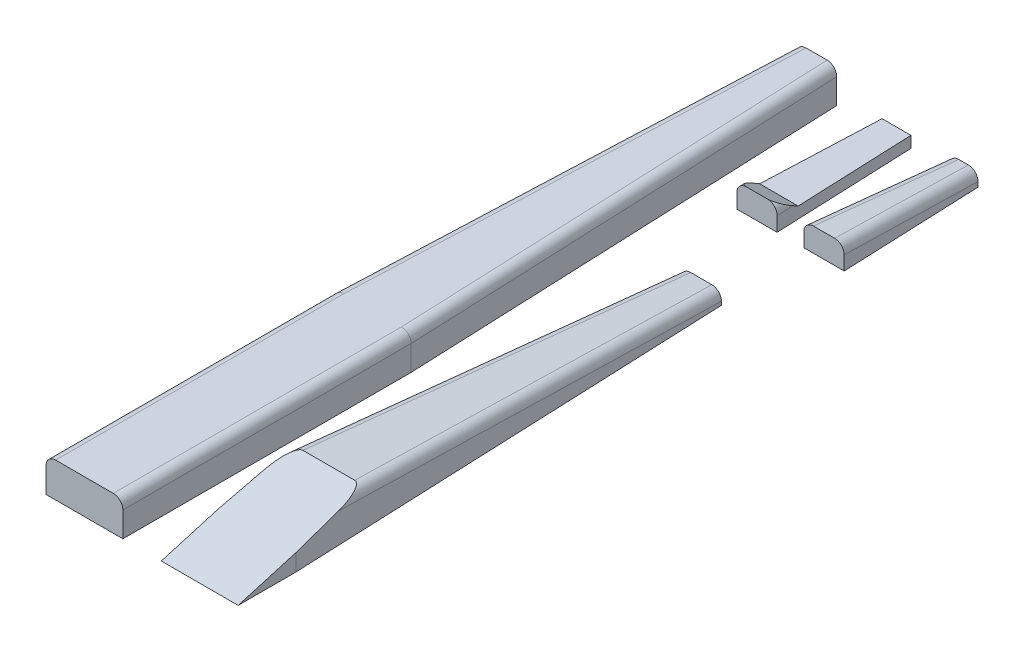
ISO-10303-21;
HEADER;
FILE_DESCRIPTION(('STEP AP214'),'2;1');
FILE_NAME('part.step','',(''),(''),'','','');
FILE_SCHEMA(('AUTOMOTIVE_DESIGN { 1 0 10303 214 1 1 1 1 }'));
ENDSEC;
DATA;
#1=APPLICATION_CONTEXT('core data for automotive mechanical design processes');
#2=APPLICATION_PROTOCOL_DEFINITION('international standard','automotive_design',2000,#1);
#3=PRODUCT_CONTEXT('',#1,'mechanical');
#4=PRODUCT('Part','Part','',(#3));
#5=PRODUCT_RELATED_PRODUCT_CATEGORY('part','',(#4));
#6=PRODUCT_DEFINITION_FORMATION('','',#4);
#7=PRODUCT_DEFINITION_CONTEXT('part definition',#1,'design');
#8=PRODUCT_DEFINITION('design','',#6,#7);
#9=PRODUCT_DEFINITION_SHAPE('','',#8);
#10=(LENGTH_UNIT() NAMED_UNIT(*) SI_UNIT(.MILLI.,.METRE.));
#11=(NAMED_UNIT(*) PLANE_ANGLE_UNIT() SI_UNIT($,.RADIAN.));
#12=(NAMED_UNIT(*) SI_UNIT($,.STERADIAN.) SOLID_ANGLE_UNIT());
#13=UNCERTAINTY_MEASURE_WITH_UNIT(LENGTH_MEASURE(1.E-05),#10,'distance_accuracy_value','');
#14=(GEOMETRIC_REPRESENTATION_CONTEXT(3) GLOBAL_UNCERTAINTY_ASSIGNED_CONTEXT((#13)) GLOBAL_UNIT_ASSIGNED_CONTEXT((#10,
#11,#12)) REPRESENTATION_CONTEXT('',''));
#15=CARTESIAN_POINT('',(0.,0.,0.));
#16=DIRECTION('',(0.,0.,1.));
#17=DIRECTION('',(1.,0.,0.));
#18=AXIS2_PLACEMENT_3D('',#15,#16,#17);
#19=CARTESIAN_POINT('',(73.3291840749564,0.,304.8));
#20=DIRECTION('',(0.,-1.,0.));
#21=DIRECTION('',(0.,0.,1.));
#22=AXIS2_PLACEMENT_3D('',#19,#20,#21);
#23=PLANE('',#22);
#24=DIRECTION('',(1.,0.,0.));
#25=VECTOR('',#24,1.);
#26=CARTESIAN_POINT('',(73.3291840749564,0.,-662.961500261916));
#27=LINE('',#26,#25);
#28=CARTESIAN_POINT('',(46.6834948564911,0.,-662.961500261916));
#29=VERTEX_POINT('',#28);
#30=CARTESIAN_POINT('',(99.9748732934217,0.,-662.961500261916));
#31=VERTEX_POINT('',#30);
#32=EDGE_CURVE('P0_E106',#29,#31,#27,.T.);
#33=ORIENTED_EDGE('',*,*,#32,.T.);
#34=DIRECTION('',(0.0411377422918956,0.,0.999153484785559));
#35=VECTOR('',#34,1.);
#36=CARTESIAN_POINT('',(139.707602562453,0.,302.067028224329));
#37=LINE('',#36,#35);
#38=CARTESIAN_POINT('',(124.129184074956,0.,-76.3015999999999));
#39=VERTEX_POINT('',#38);
#40=EDGE_CURVE('P0_E96',#31,#39,#37,.T.);
#41=ORIENTED_EDGE('',*,*,#40,.T.);
#42=DIRECTION('',(0.,0.,-1.));
#43=VECTOR('',#42,1.);
#44=CARTESIAN_POINT('',(124.129184074956,0.,-76.3015999999999));
#45=LINE('',#44,#43);
#46=CARTESIAN_POINT('',(124.129184074956,0.,1.11022302462516E-13));
#47=VERTEX_POINT('',#46);
#48=EDGE_CURVE('P0_E83',#47,#39,#45,.T.);
#49=ORIENTED_EDGE('',*,*,#48,.F.);
#50=DIRECTION('',(-1.,0.,0.));
#51=VECTOR('',#50,1.);
#52=CARTESIAN_POINT('',(124.139207207653,0.,0.));
#53=LINE('',#52,#51);
#54=CARTESIAN_POINT('',(22.5291840749564,0.,1.11022302462516E-13));
#55=VERTEX_POINT('',#54);
#56=EDGE_CURVE('P0_E94',#47,#55,#53,.T.);
#57=ORIENTED_EDGE('',*,*,#56,.T.);
#58=DIRECTION('',(0.,0.,1.));
#59=VECTOR('',#58,1.);
#60=CARTESIAN_POINT('',(22.5291840749564,0.,-76.3015999999999));
#61=LINE('',#60,#59);
#62=CARTESIAN_POINT('',(22.5291840749564,0.,-76.3015999999999));
#63=VERTEX_POINT('',#62);
#64=EDGE_CURVE('P0_E98',#63,#55,#61,.T.);
#65=ORIENTED_EDGE('',*,*,#64,.F.);
#66=DIRECTION('',(0.0411377422918955,0.,-0.999153484785559));
#67=VECTOR('',#66,1.);
#68=CARTESIAN_POINT('',(6.95076558745931,0.,302.067028224329));
#69=LINE('',#68,#67);
#70=EDGE_CURVE('P0_E102',#63,#29,#69,.T.);
#71=ORIENTED_EDGE('',*,*,#70,.T.);
#72=EDGE_LOOP('',(#33,#41,#49,#57,#65,#71));
#73=FACE_BOUND('',#72,.T.);
#74=ADVANCED_FACE('P0_F17',(#73),#23,.T.);
#75=CARTESIAN_POINT('',(73.3291840749564,5.08000000000002,-662.961500261916));
#76=DIRECTION('',(0.,0.,1.));
#77=DIRECTION('',(-1.,0.,0.));
#78=AXIS2_PLACEMENT_3D('',#75,#76,#77);
#79=PLANE('',#78);
#80=ORIENTED_EDGE('',*,*,#32,.F.);
#81=DIRECTION('',(0.,-1.,0.));
#82=VECTOR('',#81,1.);
#83=CARTESIAN_POINT('',(46.6834948564911,5.08,-662.961500261916));
#84=LINE('',#83,#82);
#85=CARTESIAN_POINT('',(46.6834948564911,4.5399926448005,-662.961500261916));
#86=VERTEX_POINT('',#85);
#87=EDGE_CURVE('P0_E117',#86,#29,#84,.T.);
#88=ORIENTED_EDGE('',*,*,#87,.F.);
#89=CARTESIAN_POINT('',(59.3942547080926,4.50557569308067,-662.961500261916));
#90=DIRECTION('',(0.,0.,1.));
#91=DIRECTION('',(-0.52999894000318,0.847998304005088,0.));
#92=AXIS2_PLACEMENT_3D('',#89,#90,#91);
#93=ELLIPSE('',#92,12.738263656327,12.7);
#94=CARTESIAN_POINT('',(59.3598830971587,17.2331027495444,-662.961500261916));
#95=VERTEX_POINT('',#94);
#96=EDGE_CURVE('P0_E107',#86,#95,#93,.F.);
#97=ORIENTED_EDGE('',*,*,#96,.T.);
#98=DIRECTION('',(-1.,0.,0.));
#99=VECTOR('',#98,1.);
#100=CARTESIAN_POINT('',(73.3291840749564,17.2331027495444,-662.961500261916));
#101=LINE('',#100,#99);
#102=CARTESIAN_POINT('',(87.298485052754,17.2331027495444,-662.961500261916));
#103=VERTEX_POINT('',#102);
#104=EDGE_CURVE('P0_E116',#103,#95,#101,.T.);
#105=ORIENTED_EDGE('',*,*,#104,.F.);
#106=CARTESIAN_POINT('',(87.2641134418202,4.50557569308069,-662.961500261916));
#107=DIRECTION('',(0.,0.,1.));
#108=DIRECTION('',(0.52999894000318,0.847998304005088,0.));
#109=AXIS2_PLACEMENT_3D('',#106,#107,#108);
#110=ELLIPSE('',#109,12.738263656327,12.7);
#111=CARTESIAN_POINT('',(99.9748732934217,4.53999264480055,-662.961500261916));
#112=VERTEX_POINT('',#111);
#113=EDGE_CURVE('P0_E97',#103,#112,#110,.F.);
#114=ORIENTED_EDGE('',*,*,#113,.T.);
#115=DIRECTION('',(0.,1.,0.));
#116=VECTOR('',#115,1.);
#117=CARTESIAN_POINT('',(99.9748732934216,5.08000000000003,-662.961500261916));
#118=LINE('',#117,#116);
#119=EDGE_CURVE('P0_E113',#31,#112,#118,.T.);
#120=ORIENTED_EDGE('',*,*,#119,.F.);
#121=EDGE_LOOP('',(#80,#88,#97,#105,#114,#120));
#122=FACE_BOUND('',#121,.T.);
#123=ADVANCED_FACE('P0_F168',(#122),#79,.F.);
#124=CARTESIAN_POINT('',(22.5291840749564,55.88,-76.3015999999999));
#125=DIRECTION('',(-1.,0.,0.));
#126=DIRECTION('',(0.,0.,-1.));
#127=AXIS2_PLACEMENT_3D('',#124,#125,#126);
#128=PLANE('',#127);
#129=DIRECTION('',(0.,-1.,0.));
#130=VECTOR('',#129,1.);
#131=CARTESIAN_POINT('',(22.5291840749564,55.88,-76.3015999999999));
#132=LINE('',#131,#130);
#133=CARTESIAN_POINT('',(22.5291840749564,22.2124679358292,-76.3015999999999));
#134=VERTEX_POINT('',#133);
#135=EDGE_CURVE('P0_E26',#134,#63,#132,.T.);
#136=ORIENTED_EDGE('',*,*,#135,.T.);
#137=ORIENTED_EDGE('',*,*,#64,.T.);
#138=DIRECTION('',(0.,-0.279510972848873,0.960142497787217));
#139=VECTOR('',#138,1.);
#140=CARTESIAN_POINT('',(22.5291840749564,24.8427904722853,-85.3369678225879));
#141=LINE('',#140,#139);
#142=EDGE_CURVE('P0_E40',#134,#55,#141,.T.);
#143=ORIENTED_EDGE('',*,*,#142,.F.);
#144=EDGE_LOOP('',(#136,#137,#143));
#145=FACE_BOUND('',#144,.T.);
#146=ADVANCED_FACE('P0_F176',(#145),#128,.T.);
#147=CARTESIAN_POINT('',(124.129184074956,55.88,-76.3015999999999));
#148=DIRECTION('',(1.,0.,0.));
#149=DIRECTION('',(0.,0.,1.));
#150=AXIS2_PLACEMENT_3D('',#147,#148,#149);
#151=PLANE('',#150);
#152=DIRECTION('',(0.,0.279510972848873,-0.960142497787217));
#153=VECTOR('',#152,1.);
#154=CARTESIAN_POINT('',(124.129184074956,24.8427904722854,-85.3369678225879));
#155=LINE('',#154,#153);
#156=CARTESIAN_POINT('',(124.129184074956,22.2124679358292,-76.3016));
#157=VERTEX_POINT('',#156);
#158=EDGE_CURVE('P0_E80',#47,#157,#155,.T.);
#159=ORIENTED_EDGE('',*,*,#158,.F.);
#160=ORIENTED_EDGE('',*,*,#48,.T.);
#161=DIRECTION('',(0.,-1.,0.));
#162=VECTOR('',#161,1.);
#163=CARTESIAN_POINT('',(124.129184074956,55.88,-76.3015999999999));
#164=LINE('',#163,#162);
#165=EDGE_CURVE('P0_E11',#39,#157,#164,.F.);
#166=ORIENTED_EDGE('',*,*,#165,.T.);
#167=EDGE_LOOP('',(#159,#160,#166));
#168=FACE_BOUND('',#167,.T.);
#169=ADVANCED_FACE('P0_F82',(#168),#151,.T.);
#170=CARTESIAN_POINT('',(6.95076558745931,5.07999999999999,302.067028224329));
#171=DIRECTION('',(0.999153484785559,0.,0.0411377422918955));
#172=DIRECTION('',(-0.0411377422918955,0.,0.999153484785559));
#173=AXIS2_PLACEMENT_3D('',#170,#171,#172);
#174=PLANE('',#173);
#175=ORIENTED_EDGE('',*,*,#70,.F.);
#176=ORIENTED_EDGE('',*,*,#135,.F.);
#177=DIRECTION('',(0.0395007060040846,0.279292826429343,-0.959393147427209));
#178=VECTOR('',#177,1.);
#179=CARTESIAN_POINT('',(7.97694215964105,-80.6802949173641,277.14325163918));
#180=LINE('',#179,#178);
#181=CARTESIAN_POINT('',(24.9482179318287,39.3164357242603,-135.055094315715));
#182=VERTEX_POINT('',#181);
#183=EDGE_CURVE('P0_E88',#134,#182,#180,.T.);
#184=ORIENTED_EDGE('',*,*,#183,.T.);
#185=DIRECTION('',(-0.041048919791328,0.0656782716661249,0.996996163891775));
#186=VECTOR('',#185,1.);
#187=CARTESIAN_POINT('',(7.12070222197621,67.8404608600243,297.939607245182));
#188=LINE('',#187,#186);
#189=EDGE_CURVE('P0_E136',#182,#86,#188,.F.);
#190=ORIENTED_EDGE('',*,*,#189,.T.);
#191=ORIENTED_EDGE('',*,*,#87,.T.);
#192=EDGE_LOOP('',(#175,#176,#184,#190,#191));
#193=FACE_BOUND('',#192,.T.);
#194=ADVANCED_FACE('P0_F19',(#193),#174,.F.);
#195=CARTESIAN_POINT('',(139.707602562453,5.08000000000004,302.067028224329));
#196=DIRECTION('',(-0.999153484785559,0.,0.0411377422918956));
#197=DIRECTION('',(-0.0411377422918956,0.,-0.999153484785559));
#198=AXIS2_PLACEMENT_3D('',#195,#196,#197);
#199=PLANE('',#198);
#200=ORIENTED_EDGE('',*,*,#40,.F.);
#201=ORIENTED_EDGE('',*,*,#119,.T.);
#202=DIRECTION('',(0.041048919791328,0.0656782716661249,0.996996163891775));
#203=VECTOR('',#202,1.);
#204=CARTESIAN_POINT('',(139.537665927937,67.8404608600244,297.939607245182));
#205=LINE('',#204,#203);
#206=CARTESIAN_POINT('',(121.710150218084,39.3164357242604,-135.055094315715));
#207=VERTEX_POINT('',#206);
#208=EDGE_CURVE('P0_E139',#112,#207,#205,.T.);
#209=ORIENTED_EDGE('',*,*,#208,.T.);
#210=DIRECTION('',(0.0395007060040849,-0.279292826429344,0.95939314742721));
#211=VECTOR('',#210,1.);
#212=CARTESIAN_POINT('',(138.681425990272,-80.6802949173641,277.14325163918));
#213=LINE('',#212,#211);
#214=EDGE_CURVE('P0_E150',#207,#157,#213,.T.);
#215=ORIENTED_EDGE('',*,*,#214,.T.);
#216=ORIENTED_EDGE('',*,*,#165,.F.);
#217=EDGE_LOOP('',(#200,#201,#209,#215,#216));
#218=FACE_BOUND('',#217,.T.);
#219=ADVANCED_FACE('P0_F177',(#218),#199,.F.);
#220=CARTESIAN_POINT('',(124.139207207653,0.,0.));
#221=DIRECTION('',(0.,-0.960142497787217,-0.279510972848873));
#222=DIRECTION('',(0.,-0.279510972848873,0.960142497787217));
#223=AXIS2_PLACEMENT_3D('',#220,#221,#222);
#224=PLANE('',#223);
#225=ORIENTED_EDGE('',*,*,#158,.T.);
#226=ORIENTED_EDGE('',*,*,#214,.F.);
#227=CARTESIAN_POINT('',(109.003359761759,39.2883698049835,-134.958685643231));
#228=DIRECTION('',(0.,-0.960142497787217,-0.279510972848873));
#229=DIRECTION('',(0.043678473320131,-0.279244218779965,0.959226176272515));
#230=AXIS2_PLACEMENT_3D('',#227,#228,#229);
#231=ELLIPSE('',#230,37.1636397060836,12.7);
#232=CARTESIAN_POINT('',(107.569833047609,49.6672595413131,-170.611000162867));
#233=VERTEX_POINT('',#232);
#234=EDGE_CURVE('P0_E135',#207,#233,#231,.F.);
#235=ORIENTED_EDGE('',*,*,#234,.T.);
#236=DIRECTION('',(1.,0.,0.));
#237=VECTOR('',#236,1.);
#238=CARTESIAN_POINT('',(73.3291840749562,49.6672595413131,-170.611000162867));
#239=LINE('',#238,#237);
#240=CARTESIAN_POINT('',(39.0885351023033,49.6672595413131,-170.611000162867));
#241=VERTEX_POINT('',#240);
#242=EDGE_CURVE('P0_E131',#241,#233,#239,.T.);
#243=ORIENTED_EDGE('',*,*,#242,.F.);
#244=CARTESIAN_POINT('',(37.6550083881533,39.2883698049835,-134.958685643231));
#245=DIRECTION('',(0.,-0.960142497787217,-0.279510972848873));
#246=DIRECTION('',(-0.0436784733201308,-0.279244218779965,0.959226176272515));
#247=AXIS2_PLACEMENT_3D('',#244,#245,#246);
#248=ELLIPSE('',#247,37.1636397060836,12.7);
#249=EDGE_CURVE('P0_E115',#241,#182,#248,.F.);
#250=ORIENTED_EDGE('',*,*,#249,.T.);
#251=ORIENTED_EDGE('',*,*,#183,.F.);
#252=ORIENTED_EDGE('',*,*,#142,.T.);
#253=ORIENTED_EDGE('',*,*,#56,.F.);
#254=EDGE_LOOP('',(#225,#226,#235,#243,#250,#251,#252,#253));
#255=FACE_BOUND('',#254,.T.);
#256=ADVANCED_FACE('P0_F100',(#255),#224,.F.);
#257=CARTESIAN_POINT('',(73.3291840749563,80.6575259125343,299.821243352271));
#258=DIRECTION('',(0.,-0.997837203068467,0.0657336760914669));
#259=DIRECTION('',(0.,0.0657336760914669,0.997837203068468));
#260=AXIS2_PLACEMENT_3D('',#257,#258,#259);
#261=PLANE('',#260);
#262=DIRECTION('',(0.041048919791328,0.0656782716661249,0.996996163891775));
#263=VECTOR('',#262,1.);
#264=CARTESIAN_POINT('',(126.84841667116,80.5129933389939,297.627238885928));
#265=LINE('',#264,#263);
#266=EDGE_CURVE('P0_E112',#233,#103,#265,.F.);
#267=ORIENTED_EDGE('',*,*,#266,.T.);
#268=ORIENTED_EDGE('',*,*,#104,.T.);
#269=DIRECTION('',(-0.041048919791328,0.0656782716661249,0.996996163891775));
#270=VECTOR('',#269,1.);
#271=CARTESIAN_POINT('',(19.8099514787528,80.5129933389939,297.627238885928));
#272=LINE('',#271,#270);
#273=EDGE_CURVE('P0_E130',#95,#241,#272,.T.);
#274=ORIENTED_EDGE('',*,*,#273,.T.);
#275=ORIENTED_EDGE('',*,*,#242,.T.);
#276=EDGE_LOOP('',(#267,#268,#274,#275));
#277=FACE_BOUND('',#276,.T.);
#278=ADVANCED_FACE('P0_F155',(#277),#261,.F.);
#279=CARTESIAN_POINT('',(19.8099514787528,67.8404608600243,298.462056572289));
#280=DIRECTION('',(-0.041048919791328,0.0656782716661249,0.996996163891775));
#281=DIRECTION('',(0.,0.997837203068468,-0.0657336760914669));
#282=AXIS2_PLACEMENT_3D('',#279,#280,#281);
#283=CYLINDRICAL_SURFACE('',#282,12.7);
#284=ORIENTED_EDGE('',*,*,#96,.F.);
#285=ORIENTED_EDGE('',*,*,#189,.F.);
#286=ORIENTED_EDGE('',*,*,#249,.F.);
#287=ORIENTED_EDGE('',*,*,#273,.F.);
#288=EDGE_LOOP('',(#284,#285,#286,#287));
#289=FACE_BOUND('',#288,.T.);
#290=ADVANCED_FACE('P0_F172',(#289),#283,.T.);
#291=CARTESIAN_POINT('',(126.84841667116,67.8404608600244,298.462056572289));
#292=DIRECTION('',(0.041048919791328,0.0656782716661249,0.996996163891775));
#293=DIRECTION('',(0.,0.997837203068467,-0.0657336760914669));
#294=AXIS2_PLACEMENT_3D('',#291,#292,#293);
#295=CYLINDRICAL_SURFACE('',#294,12.7);
#296=ORIENTED_EDGE('',*,*,#113,.F.);
#297=ORIENTED_EDGE('',*,*,#266,.F.);
#298=ORIENTED_EDGE('',*,*,#234,.F.);
#299=ORIENTED_EDGE('',*,*,#208,.F.);
#300=EDGE_LOOP('',(#296,#297,#298,#299));
#301=FACE_BOUND('',#300,.T.);
#302=ADVANCED_FACE('P0_F162',(#301),#295,.T.);
#303=CLOSED_SHELL('',(#74,#123,#146,#169,#194,#219,#256,#278,#290,#302));
#304=MANIFOLD_SOLID_BREP('P0_B1',#303);
#305=CARTESIAN_POINT('',(-129.88083905774,0.,0.));
#306=DIRECTION('',(0.,1.,0.));
#307=DIRECTION('',(0.,0.,1.));
#308=AXIS2_PLACEMENT_3D('',#305,#306,#307);
#309=PLANE('',#308);
#310=DIRECTION('',(0.,0.,-1.));
#311=VECTOR('',#310,1.);
#312=CARTESIAN_POINT('',(-129.870815925044,0.,-381.1016));
#313=LINE('',#312,#311);
#314=CARTESIAN_POINT('',(-129.870815925044,0.,0.));
#315=VERTEX_POINT('',#314);
#316=CARTESIAN_POINT('',(-129.870815925044,0.,-381.1016));
#317=VERTEX_POINT('',#316);
#318=EDGE_CURVE('P1_E108',#315,#317,#313,.T.);
#319=ORIENTED_EDGE('',*,*,#318,.T.);
#320=DIRECTION('',(-0.0411377422918956,0.,0.999153484785559));
#321=VECTOR('',#320,1.);
#322=CARTESIAN_POINT('',(-145.449234412541,0.,-2.732971775671));
#323=LINE('',#322,#321);
#324=CARTESIAN_POINT('',(-105.716505143509,0.,-967.761500261916));
#325=VERTEX_POINT('',#324);
#326=EDGE_CURVE('P1_E21',#325,#317,#323,.T.);
#327=ORIENTED_EDGE('',*,*,#326,.F.);
#328=DIRECTION('',(-1.,0.,0.));
#329=VECTOR('',#328,1.);
#330=CARTESIAN_POINT('',(-79.0708159250436,0.,-967.761500261916));
#331=LINE('',#330,#329);
#332=CARTESIAN_POINT('',(-52.4251267065783,0.,-967.761500261916));
#333=VERTEX_POINT('',#332);
#334=EDGE_CURVE('P1_E11',#333,#325,#331,.T.);
#335=ORIENTED_EDGE('',*,*,#334,.F.);
#336=DIRECTION('',(-0.0411377422918955,0.,-0.999153484785559));
#337=VECTOR('',#336,1.);
#338=CARTESIAN_POINT('',(-12.6923974375465,0.,-2.73297177567099));
#339=LINE('',#338,#337);
#340=CARTESIAN_POINT('',(-28.2708159250436,0.,-381.1016));
#341=VERTEX_POINT('',#340);
#342=EDGE_CURVE('P1_E26',#341,#333,#339,.T.);
#343=ORIENTED_EDGE('',*,*,#342,.F.);
#344=DIRECTION('',(0.,0.,1.));
#345=VECTOR('',#344,1.);
#346=CARTESIAN_POINT('',(-28.2708159250436,0.,-381.1016));
#347=LINE('',#346,#345);
#348=CARTESIAN_POINT('',(-28.2708159250436,0.,0.));
#349=VERTEX_POINT('',#348);
#350=EDGE_CURVE('P1_E33',#341,#349,#347,.T.);
#351=ORIENTED_EDGE('',*,*,#350,.T.);
#352=DIRECTION('',(1.,0.,0.));
#353=VECTOR('',#352,1.);
#354=CARTESIAN_POINT('',(-129.88083905774,0.,0.));
#355=LINE('',#354,#353);
#356=EDGE_CURVE('P1_E145',#315,#349,#355,.T.);
#357=ORIENTED_EDGE('',*,*,#356,.F.);
#358=EDGE_LOOP('',(#319,#327,#335,#343,#351,#357));
#359=FACE_BOUND('',#358,.T.);
#360=ADVANCED_FACE('P1_F17',(#359),#309,.F.);
#361=CARTESIAN_POINT('',(-25.3816466943231,33.02,-2.21052244856392));
#362=DIRECTION('',(-0.0411377422918955,0.,-0.999153484785559));
#363=DIRECTION('',(-0.999153484785559,0.,0.0411377422918955));
#364=AXIS2_PLACEMENT_3D('',#361,#362,#363);
#365=CYLINDRICAL_SURFACE('',#364,12.7);
#366=CARTESIAN_POINT('',(-65.1358865581798,33.0199999999999,-967.761500261916));
#367=DIRECTION('',(0.,0.,1.));
#368=DIRECTION('',(-1.,0.,0.));
#369=AXIS2_PLACEMENT_3D('',#366,#367,#368);
#370=ELLIPSE('',#369,12.7107598516015,12.7);
#371=CARTESIAN_POINT('',(-65.1358865581798,45.7199999999999,-967.761500261916));
#372=VERTEX_POINT('',#371);
#373=CARTESIAN_POINT('',(-52.4251267065783,33.02,-967.761500261916));
#374=VERTEX_POINT('',#373);
#375=EDGE_CURVE('P1_E170',#372,#374,#370,.F.);
#376=ORIENTED_EDGE('',*,*,#375,.F.);
#377=DIRECTION('',(0.0411377422918955,0.,0.999153484785559));
#378=VECTOR('',#377,1.);
#379=CARTESIAN_POINT('',(-72.7100651818201,45.7199999999999,-1151.72315067289));
#380=LINE('',#379,#378);
#381=CARTESIAN_POINT('',(-40.9708159250436,45.72,-380.840264724303));
#382=VERTEX_POINT('',#381);
#383=EDGE_CURVE('P1_E124',#382,#372,#380,.F.);
#384=ORIENTED_EDGE('',*,*,#383,.F.);
#385=CARTESIAN_POINT('',(-40.9708159250437,33.02,-380.840264724309));
#386=DIRECTION('',(-0.0205732254938469,0.,-0.999788348798274));
#387=DIRECTION('',(-0.999788348798274,0.,0.0205732254938442));
#388=AXIS2_PLACEMENT_3D('',#385,#386,#387);
#389=ELLIPSE('',#388,12.7026885392945,12.7);
#390=CARTESIAN_POINT('',(-28.2708159250436,33.02,-381.1016));
#391=VERTEX_POINT('',#390);
#392=EDGE_CURVE('P1_E141',#391,#382,#389,.F.);
#393=ORIENTED_EDGE('',*,*,#392,.F.);
#394=DIRECTION('',(0.0411377422918955,0.,0.999153484785559));
#395=VECTOR('',#394,1.);
#396=CARTESIAN_POINT('',(-28.2708159250434,33.02,-381.101599999996));
#397=LINE('',#396,#395);
#398=EDGE_CURVE('P1_E150',#374,#391,#397,.T.);
#399=ORIENTED_EDGE('',*,*,#398,.F.);
#400=EDGE_LOOP('',(#376,#384,#393,#399));
#401=FACE_BOUND('',#400,.T.);
#402=ADVANCED_FACE('P1_F168',(#401),#365,.T.);
#403=CARTESIAN_POINT('',(-117.009627582034,33.0199999999999,-384.755207199316));
#404=DIRECTION('',(0.0411377422918956,0.,-0.999153484785559));
#405=DIRECTION('',(-0.999153484785559,0.,-0.0411377422918956));
#406=AXIS2_PLACEMENT_3D('',#403,#404,#405);
#407=CYLINDRICAL_SURFACE('',#406,12.7);
#408=CARTESIAN_POINT('',(-93.0057452919073,33.0199999999999,-967.761500261916));
#409=DIRECTION('',(0.,0.,1.));
#410=DIRECTION('',(1.,0.,0.));
#411=AXIS2_PLACEMENT_3D('',#408,#409,#410);
#412=ELLIPSE('',#411,12.7107598516015,12.7);
#413=CARTESIAN_POINT('',(-105.716505143509,33.0199999999999,-967.761500261916));
#414=VERTEX_POINT('',#413);
#415=CARTESIAN_POINT('',(-93.0057452919073,45.7199999999999,-967.761500261916));
#416=VERTEX_POINT('',#415);
#417=EDGE_CURVE('P1_E179',#414,#416,#412,.F.);
#418=ORIENTED_EDGE('',*,*,#417,.F.);
#419=DIRECTION('',(-0.0411377422918956,0.,0.999153484785559));
#420=VECTOR('',#419,1.);
#421=CARTESIAN_POINT('',(-98.1208159250436,33.0199999999999,-1152.2456));
#422=LINE('',#421,#420);
#423=CARTESIAN_POINT('',(-129.870815925044,33.0199999999999,-381.1016));
#424=VERTEX_POINT('',#423);
#425=EDGE_CURVE('P1_E99',#424,#414,#422,.F.);
#426=ORIENTED_EDGE('',*,*,#425,.F.);
#427=CARTESIAN_POINT('',(-117.170815925044,33.0199999999999,-380.840264724303));
#428=DIRECTION('',(0.0205732254938469,0.,-0.999788348798274));
#429=DIRECTION('',(0.999788348798274,0.,0.0205732254938469));
#430=AXIS2_PLACEMENT_3D('',#427,#428,#429);
#431=ELLIPSE('',#430,12.7026885392945,12.7);
#432=CARTESIAN_POINT('',(-117.170815925044,45.7199999999999,-380.840264724303));
#433=VERTEX_POINT('',#432);
#434=EDGE_CURVE('P1_E110',#433,#424,#431,.F.);
#435=ORIENTED_EDGE('',*,*,#434,.F.);
#436=DIRECTION('',(-0.0411377422918956,0.,0.999153484785559));
#437=VECTOR('',#436,1.);
#438=CARTESIAN_POINT('',(-117.181566668267,45.7199999999999,-380.57915067289));
#439=LINE('',#438,#437);
#440=EDGE_CURVE('P1_E133',#416,#433,#439,.T.);
#441=ORIENTED_EDGE('',*,*,#440,.F.);
#442=EDGE_LOOP('',(#418,#426,#435,#441));
#443=FACE_BOUND('',#442,.T.);
#444=ADVANCED_FACE('P1_F207',(#443),#407,.T.);
#445=CARTESIAN_POINT('',(-117.170815925044,33.0199999999999,-381.1016));
#446=DIRECTION('',(0.,0.,1.));
#447=DIRECTION('',(1.,0.,0.));
#448=AXIS2_PLACEMENT_3D('',#445,#446,#447);
#449=CYLINDRICAL_SURFACE('',#448,12.7);
#450=ORIENTED_EDGE('',*,*,#434,.T.);
#451=DIRECTION('',(0.,0.,1.));
#452=VECTOR('',#451,1.);
#453=CARTESIAN_POINT('',(-129.870815925044,33.0199999999999,-381.1016));
#454=LINE('',#453,#452);
#455=CARTESIAN_POINT('',(-129.870815925044,33.0199999999999,0.));
#456=VERTEX_POINT('',#455);
#457=EDGE_CURVE('P1_E106',#456,#424,#454,.F.);
#458=ORIENTED_EDGE('',*,*,#457,.F.);
#459=CARTESIAN_POINT('',(-117.170815925044,33.0199999999999,0.));
#460=DIRECTION('',(0.,0.,1.));
#461=DIRECTION('',(1.,0.,0.));
#462=AXIS2_PLACEMENT_3D('',#459,#460,#461);
#463=CIRCLE('',#462,12.7);
#464=CARTESIAN_POINT('',(-117.170815925044,45.7199999999999,0.));
#465=VERTEX_POINT('',#464);
#466=EDGE_CURVE('P1_E89',#465,#456,#463,.T.);
#467=ORIENTED_EDGE('',*,*,#466,.F.);
#468=DIRECTION('',(0.,0.,1.));
#469=VECTOR('',#468,1.);
#470=CARTESIAN_POINT('',(-117.170815925044,45.7199999999999,-381.1016));
#471=LINE('',#470,#469);
#472=EDGE_CURVE('P1_E136',#433,#465,#471,.T.);
#473=ORIENTED_EDGE('',*,*,#472,.F.);
#474=EDGE_LOOP('',(#450,#458,#467,#473));
#475=FACE_BOUND('',#474,.T.);
#476=ADVANCED_FACE('P1_F113',(#475),#449,.T.);
#477=CARTESIAN_POINT('',(-28.2708159250436,45.72,-381.1016));
#478=DIRECTION('',(0.,1.,0.));
#479=DIRECTION('',(-1.,0.,0.));
#480=AXIS2_PLACEMENT_3D('',#477,#478,#479);
#481=PLANE('',#480);
#482=DIRECTION('',(1.,0.,0.));
#483=VECTOR('',#482,1.);
#484=CARTESIAN_POINT('',(-256.921615925044,45.7199999999999,-967.761500261916));
#485=LINE('',#484,#483);
#486=EDGE_CURVE('P1_E174',#416,#372,#485,.T.);
#487=ORIENTED_EDGE('',*,*,#486,.F.);
#488=ORIENTED_EDGE('',*,*,#440,.T.);
#489=ORIENTED_EDGE('',*,*,#472,.T.);
#490=DIRECTION('',(-1.,0.,0.));
#491=VECTOR('',#490,1.);
#492=CARTESIAN_POINT('',(-28.2708159250436,45.72,0.));
#493=LINE('',#492,#491);
#494=CARTESIAN_POINT('',(-40.9708159250436,45.72,0.));
#495=VERTEX_POINT('',#494);
#496=EDGE_CURVE('P1_E94',#495,#465,#493,.T.);
#497=ORIENTED_EDGE('',*,*,#496,.F.);
#498=DIRECTION('',(0.,0.,1.));
#499=VECTOR('',#498,1.);
#500=CARTESIAN_POINT('',(-40.9708159250436,45.72,-381.1016));
#501=LINE('',#500,#499);
#502=EDGE_CURVE('P1_E129',#495,#382,#501,.F.);
#503=ORIENTED_EDGE('',*,*,#502,.T.);
#504=ORIENTED_EDGE('',*,*,#383,.T.);
#505=EDGE_LOOP('',(#487,#488,#489,#497,#503,#504));
#506=FACE_BOUND('',#505,.T.);
#507=ADVANCED_FACE('P1_F173',(#506),#481,.T.);
#508=CARTESIAN_POINT('',(-40.9708159250436,33.02,-381.1016));
#509=DIRECTION('',(0.,0.,1.));
#510=DIRECTION('',(1.,0.,0.));
#511=AXIS2_PLACEMENT_3D('',#508,#509,#510);
#512=CYLINDRICAL_SURFACE('',#511,12.7);
#513=ORIENTED_EDGE('',*,*,#392,.T.);
#514=ORIENTED_EDGE('',*,*,#502,.F.);
#515=CARTESIAN_POINT('',(-40.9708159250436,33.02,0.));
#516=DIRECTION('',(0.,0.,1.));
#517=DIRECTION('',(1.,0.,0.));
#518=AXIS2_PLACEMENT_3D('',#515,#516,#517);
#519=CIRCLE('',#518,12.7);
#520=CARTESIAN_POINT('',(-28.2708159250436,33.02,0.));
#521=VERTEX_POINT('',#520);
#522=EDGE_CURVE('P1_E100',#521,#495,#519,.T.);
#523=ORIENTED_EDGE('',*,*,#522,.F.);
#524=DIRECTION('',(0.,0.,1.));
#525=VECTOR('',#524,1.);
#526=CARTESIAN_POINT('',(-28.2708159250436,33.02,-381.1016));
#527=LINE('',#526,#525);
#528=EDGE_CURVE('P1_E154',#391,#521,#527,.T.);
#529=ORIENTED_EDGE('',*,*,#528,.F.);
#530=EDGE_LOOP('',(#513,#514,#523,#529));
#531=FACE_BOUND('',#530,.T.);
#532=ADVANCED_FACE('P1_F162',(#531),#512,.T.);
#533=CARTESIAN_POINT('',(-28.2708159250436,-55.88,-381.1016));
#534=DIRECTION('',(1.,0.,0.));
#535=DIRECTION('',(0.,0.,-1.));
#536=AXIS2_PLACEMENT_3D('',#533,#534,#535);
#537=PLANE('',#536);
#538=ORIENTED_EDGE('',*,*,#350,.F.);
#539=DIRECTION('',(0.,1.,0.));
#540=VECTOR('',#539,1.);
#541=CARTESIAN_POINT('',(-28.2708159250436,-55.88,-381.1016));
#542=LINE('',#541,#540);
#543=EDGE_CURVE('P1_E115',#341,#391,#542,.T.);
#544=ORIENTED_EDGE('',*,*,#543,.T.);
#545=ORIENTED_EDGE('',*,*,#528,.T.);
#546=DIRECTION('',(0.,1.,0.));
#547=VECTOR('',#546,1.);
#548=CARTESIAN_POINT('',(-28.2708159250436,-55.88,0.));
#549=LINE('',#548,#547);
#550=EDGE_CURVE('P1_E109',#349,#521,#549,.T.);
#551=ORIENTED_EDGE('',*,*,#550,.F.);
#552=EDGE_LOOP('',(#538,#544,#545,#551));
#553=FACE_BOUND('',#552,.T.);
#554=ADVANCED_FACE('P1_F194',(#553),#537,.T.);
#555=CARTESIAN_POINT('',(-129.870815925044,-55.8800000000001,-381.1016));
#556=DIRECTION('',(-1.,0.,0.));
#557=DIRECTION('',(0.,0.,1.));
#558=AXIS2_PLACEMENT_3D('',#555,#556,#557);
#559=PLANE('',#558);
#560=DIRECTION('',(0.,1.,0.));
#561=VECTOR('',#560,1.);
#562=CARTESIAN_POINT('',(-129.870815925044,-55.8800000000001,-381.1016));
#563=LINE('',#562,#561);
#564=EDGE_CURVE('P1_E118',#424,#317,#563,.F.);
#565=ORIENTED_EDGE('',*,*,#564,.T.);
#566=ORIENTED_EDGE('',*,*,#318,.F.);
#567=DIRECTION('',(0.,-1.,0.));
#568=VECTOR('',#567,1.);
#569=CARTESIAN_POINT('',(-129.870815925044,-55.8800000000001,0.));
#570=LINE('',#569,#568);
#571=EDGE_CURVE('P1_E92',#456,#315,#570,.T.);
#572=ORIENTED_EDGE('',*,*,#571,.F.);
#573=ORIENTED_EDGE('',*,*,#457,.T.);
#574=EDGE_LOOP('',(#565,#566,#572,#573));
#575=FACE_BOUND('',#574,.T.);
#576=ADVANCED_FACE('P1_F105',(#575),#559,.T.);
#577=CARTESIAN_POINT('',(-79.0708159250436,-5.08000000000006,0.));
#578=DIRECTION('',(0.,0.,1.));
#579=DIRECTION('',(1.,0.,0.));
#580=AXIS2_PLACEMENT_3D('',#577,#578,#579);
#581=PLANE('',#580);
#582=ORIENTED_EDGE('',*,*,#571,.T.);
#583=ORIENTED_EDGE('',*,*,#356,.T.);
#584=ORIENTED_EDGE('',*,*,#550,.T.);
#585=ORIENTED_EDGE('',*,*,#522,.T.);
#586=ORIENTED_EDGE('',*,*,#496,.T.);
#587=ORIENTED_EDGE('',*,*,#466,.T.);
#588=EDGE_LOOP('',(#582,#583,#584,#585,#586,#587));
#589=FACE_BOUND('',#588,.T.);
#590=ADVANCED_FACE('P1_F91',(#589),#581,.T.);
#591=CARTESIAN_POINT('',(-79.0708159250436,-5.08000000000006,-967.761500261916));
#592=DIRECTION('',(0.,0.,1.));
#593=DIRECTION('',(1.,0.,0.));
#594=AXIS2_PLACEMENT_3D('',#591,#592,#593);
#595=PLANE('',#594);
#596=DIRECTION('',(0.,1.,0.));
#597=VECTOR('',#596,1.);
#598=CARTESIAN_POINT('',(-52.4251267065783,-5.08000000000006,-967.761500261916));
#599=LINE('',#598,#597);
#600=EDGE_CURVE('P1_E184',#333,#374,#599,.T.);
#601=ORIENTED_EDGE('',*,*,#600,.F.);
#602=ORIENTED_EDGE('',*,*,#334,.T.);
#603=DIRECTION('',(0.,-1.,0.));
#604=VECTOR('',#603,1.);
#605=CARTESIAN_POINT('',(-105.716505143509,-5.08000000000006,-967.761500261916));
#606=LINE('',#605,#604);
#607=EDGE_CURVE('P1_E149',#414,#325,#606,.T.);
#608=ORIENTED_EDGE('',*,*,#607,.F.);
#609=ORIENTED_EDGE('',*,*,#417,.T.);
#610=ORIENTED_EDGE('',*,*,#486,.T.);
#611=ORIENTED_EDGE('',*,*,#375,.T.);
#612=EDGE_LOOP('',(#601,#602,#608,#609,#610,#611));
#613=FACE_BOUND('',#612,.T.);
#614=ADVANCED_FACE('P1_F19',(#613),#595,.F.);
#615=CARTESIAN_POINT('',(-145.449234412541,-5.08000000000006,-2.732971775671));
#616=DIRECTION('',(0.999153484785559,0.,0.0411377422918956));
#617=DIRECTION('',(0.0411377422918956,0.,-0.999153484785559));
#618=AXIS2_PLACEMENT_3D('',#615,#616,#617);
#619=PLANE('',#618);
#620=ORIENTED_EDGE('',*,*,#607,.T.);
#621=ORIENTED_EDGE('',*,*,#326,.T.);
#622=ORIENTED_EDGE('',*,*,#564,.F.);
#623=ORIENTED_EDGE('',*,*,#425,.T.);
#624=EDGE_LOOP('',(#620,#621,#622,#623));
#625=FACE_BOUND('',#624,.T.);
#626=ADVANCED_FACE('P1_F191',(#625),#619,.F.);
#627=CARTESIAN_POINT('',(-12.6923974375465,-5.08000000000006,-2.73297177567099));
#628=DIRECTION('',(-0.999153484785559,0.,0.0411377422918955));
#629=DIRECTION('',(0.0411377422918955,0.,0.999153484785559));
#630=AXIS2_PLACEMENT_3D('',#627,#628,#629);
#631=PLANE('',#630);
#632=ORIENTED_EDGE('',*,*,#543,.F.);
#633=ORIENTED_EDGE('',*,*,#342,.T.);
#634=ORIENTED_EDGE('',*,*,#600,.T.);
#635=ORIENTED_EDGE('',*,*,#398,.T.);
#636=EDGE_LOOP('',(#632,#633,#634,#635));
#637=FACE_BOUND('',#636,.T.);
#638=ADVANCED_FACE('P1_F195',(#637),#631,.F.);
#639=CLOSED_SHELL('',(#360,#402,#444,#476,#507,#532,#554,#576,#590,#614,#626,#638));
#640=MANIFOLD_SOLID_BREP('P1_B1',#639);
#641=CARTESIAN_POINT('',(115.279143549277,0.,184.484099738084));
#642=DIRECTION('',(0.,-1.,0.));
#643=DIRECTION('',(0.,0.,1.));
#644=AXIS2_PLACEMENT_3D('',#641,#642,#643);
#645=PLANE('',#644);
#646=DIRECTION('',(-1.,0.,0.));
#647=VECTOR('',#646,1.);
#648=CARTESIAN_POINT('',(115.279143549277,0.,-967.761500261916));
#649=LINE('',#648,#647);
#650=CARTESIAN_POINT('',(134.329143549277,0.,-967.761500261916));
#651=VERTEX_POINT('',#650);
#652=CARTESIAN_POINT('',(96.2291435492771,0.,-967.761500261916));
#653=VERTEX_POINT('',#652);
#654=EDGE_CURVE('P2_E83',#651,#653,#649,.T.);
#655=ORIENTED_EDGE('',*,*,#654,.F.);
#656=DIRECTION('',(0.0411377422918956,0.,0.999153484785559));
#657=VECTOR('',#656,1.);
#658=CARTESIAN_POINT('',(181.657562036774,0.,181.751127962413));
#659=LINE('',#658,#657);
#660=CARTESIAN_POINT('',(141.924832767742,0.,-783.277400523832));
#661=VERTEX_POINT('',#660);
#662=EDGE_CURVE('P2_E82',#651,#661,#659,.T.);
#663=ORIENTED_EDGE('',*,*,#662,.T.);
#664=DIRECTION('',(1.,0.,0.));
#665=VECTOR('',#664,1.);
#666=CARTESIAN_POINT('',(115.279143549277,0.,-783.277400523832));
#667=LINE('',#666,#665);
#668=CARTESIAN_POINT('',(88.6334543308118,0.,-783.277400523832));
#669=VERTEX_POINT('',#668);
#670=EDGE_CURVE('P2_E71',#669,#661,#667,.T.);
#671=ORIENTED_EDGE('',*,*,#670,.F.);
#672=DIRECTION('',(0.0411377422918955,0.,-0.999153484785559));
#673=VECTOR('',#672,1.);
#674=CARTESIAN_POINT('',(48.90072506178,0.,181.751127962413));
#675=LINE('',#674,#673);
#676=EDGE_CURVE('P2_E80',#669,#653,#675,.T.);
#677=ORIENTED_EDGE('',*,*,#676,.T.);
#678=EDGE_LOOP('',(#655,#663,#671,#677));
#679=FACE_BOUND('',#678,.T.);
#680=ADVANCED_FACE('P2_F16',(#679),#645,.T.);
#681=CARTESIAN_POINT('',(115.279143549277,19.05,-783.277400523832));
#682=DIRECTION('',(0.,0.,1.));
#683=DIRECTION('',(-1.,0.,0.));
#684=AXIS2_PLACEMENT_3D('',#681,#682,#683);
#685=PLANE('',#684);
#686=DIRECTION('',(0.,-1.,0.));
#687=VECTOR('',#686,1.);
#688=CARTESIAN_POINT('',(88.6334543308118,19.05,-783.277400523832));
#689=LINE('',#688,#687);
#690=CARTESIAN_POINT('',(88.6334543308118,18.5099926448005,-783.277400523832));
#691=VERTEX_POINT('',#690);
#692=EDGE_CURVE('P2_E68',#691,#669,#689,.T.);
#693=ORIENTED_EDGE('',*,*,#692,.T.);
#694=ORIENTED_EDGE('',*,*,#670,.T.);
#695=DIRECTION('',(0.,1.,0.));
#696=VECTOR('',#695,1.);
#697=CARTESIAN_POINT('',(141.924832767742,19.05,-783.277400523832));
#698=LINE('',#697,#696);
#699=CARTESIAN_POINT('',(141.924832767742,18.5099926448005,-783.277400523832));
#700=VERTEX_POINT('',#699);
#701=EDGE_CURVE('P2_E10',#661,#700,#698,.T.);
#702=ORIENTED_EDGE('',*,*,#701,.T.);
#703=CARTESIAN_POINT('',(129.214072916141,18.4755756930807,-783.277400523832));
#704=DIRECTION('',(0.,0.,1.));
#705=DIRECTION('',(0.52999894000318,0.847998304005088,0.));
#706=AXIS2_PLACEMENT_3D('',#703,#704,#705);
#707=ELLIPSE('',#706,12.738263656327,12.7);
#708=CARTESIAN_POINT('',(129.248444527075,31.2031027495444,-783.277400523832));
#709=VERTEX_POINT('',#708);
#710=EDGE_CURVE('P2_E179',#709,#700,#707,.F.);
#711=ORIENTED_EDGE('',*,*,#710,.F.);
#712=DIRECTION('',(-1.,0.,0.));
#713=VECTOR('',#712,1.);
#714=CARTESIAN_POINT('',(115.279143549277,31.2031027495444,-783.277400523832));
#715=LINE('',#714,#713);
#716=CARTESIAN_POINT('',(101.309842571479,31.2031027495444,-783.277400523832));
#717=VERTEX_POINT('',#716);
#718=EDGE_CURVE('P2_E26',#709,#717,#715,.T.);
#719=ORIENTED_EDGE('',*,*,#718,.T.);
#720=CARTESIAN_POINT('',(101.344214182413,18.4755756930807,-783.277400523832));
#721=DIRECTION('',(0.,0.,1.));
#722=DIRECTION('',(-0.52999894000318,0.847998304005088,0.));
#723=AXIS2_PLACEMENT_3D('',#720,#721,#722);
#724=ELLIPSE('',#723,12.738263656327,12.7);
#725=EDGE_CURVE('P2_E34',#691,#717,#724,.F.);
#726=ORIENTED_EDGE('',*,*,#725,.F.);
#727=EDGE_LOOP('',(#693,#694,#702,#711,#719,#726));
#728=FACE_BOUND('',#727,.T.);
#729=ADVANCED_FACE('P2_F70',(#728),#685,.T.);
#730=CARTESIAN_POINT('',(115.279143549277,19.05,-967.761500261916));
#731=DIRECTION('',(0.,0.,-1.));
#732=DIRECTION('',(1.,0.,0.));
#733=AXIS2_PLACEMENT_3D('',#730,#731,#732);
#734=PLANE('',#733);
#735=CARTESIAN_POINT('',(134.329143549277,6.35688989525613,-967.761500261916));
#736=DIRECTION('',(0.,-1.,0.));
#737=VECTOR('',#736,1.);
#738=LINE('',#735,#737);
#739=CARTESIAN_POINT('',(134.329143549277,6.35688989525613,-967.761500261916));
#740=VERTEX_POINT('',#739);
#741=EDGE_CURVE('P2_E113',#740,#651,#738,.T.);
#742=ORIENTED_EDGE('',*,*,#741,.T.);
#743=ORIENTED_EDGE('',*,*,#654,.T.);
#744=CARTESIAN_POINT('',(96.2291435492771,0.,-967.761500261916));
#745=DIRECTION('',(0.,1.,0.));
#746=VECTOR('',#745,1.);
#747=LINE('',#744,#746);
#748=CARTESIAN_POINT('',(96.2291435492771,6.35688989525607,-967.761500261916));
#749=VERTEX_POINT('',#748);
#750=EDGE_CURVE('P2_E86',#653,#749,#747,.T.);
#751=ORIENTED_EDGE('',*,*,#750,.T.);
#752=CARTESIAN_POINT('',(108.939903400879,6.32247294353625,-967.761500261916));
#753=DIRECTION('',(0.,0.,-1.));
#754=DIRECTION('',(-0.52999894000318,0.847998304005088,0.));
#755=AXIS2_PLACEMENT_3D('',#752,#753,#754);
#756=ELLIPSE('',#755,12.738263656327,12.7);
#757=CARTESIAN_POINT('',(108.905531789945,19.05,-967.761500261916));
#758=VERTEX_POINT('',#757);
#759=EDGE_CURVE('P2_E182',#749,#758,#756,.T.);
#760=ORIENTED_EDGE('',*,*,#759,.T.);
#761=CARTESIAN_POINT('',(108.905531789945,19.05,-967.761500261916));
#762=DIRECTION('',(1.,0.,0.));
#763=VECTOR('',#762,1.);
#764=LINE('',#761,#763);
#765=CARTESIAN_POINT('',(121.652755308609,19.05,-967.761500261916));
#766=VERTEX_POINT('',#765);
#767=EDGE_CURVE('P2_E171',#758,#766,#764,.T.);
#768=ORIENTED_EDGE('',*,*,#767,.T.);
#769=CARTESIAN_POINT('',(121.618383697676,6.32247294353628,-967.761500261916));
#770=DIRECTION('',(0.,0.,-1.));
#771=DIRECTION('',(0.52999894000318,0.847998304005088,0.));
#772=AXIS2_PLACEMENT_3D('',#769,#770,#771);
#773=ELLIPSE('',#772,12.738263656327,12.7);
#774=EDGE_CURVE('P2_E122',#766,#740,#773,.T.);
#775=ORIENTED_EDGE('',*,*,#774,.T.);
#776=EDGE_LOOP('',(#742,#743,#751,#760,#768,#775));
#777=FACE_BOUND('',#776,.T.);
#778=ADVANCED_FACE('P2_F141',(#777),#734,.T.);
#779=CARTESIAN_POINT('',(181.657562036774,19.05,181.751127962413));
#780=DIRECTION('',(-0.999153484785559,0.,0.0411377422918956));
#781=DIRECTION('',(-0.0411377422918956,0.,-0.999153484785559));
#782=AXIS2_PLACEMENT_3D('',#779,#780,#781);
#783=PLANE('',#782);
#784=ORIENTED_EDGE('',*,*,#662,.F.);
#785=ORIENTED_EDGE('',*,*,#741,.F.);
#786=DIRECTION('',(0.041048919791328,0.0656782716661249,0.996996163891775));
#787=VECTOR('',#786,1.);
#788=CARTESIAN_POINT('',(181.487625402257,81.8104608600244,177.623706983266));
#789=LINE('',#788,#787);
#790=EDGE_CURVE('P2_E117',#740,#700,#789,.T.);
#791=ORIENTED_EDGE('',*,*,#790,.T.);
#792=ORIENTED_EDGE('',*,*,#701,.F.);
#793=EDGE_LOOP('',(#784,#785,#791,#792));
#794=FACE_BOUND('',#793,.T.);
#795=ADVANCED_FACE('P2_F18',(#794),#783,.F.);
#796=CARTESIAN_POINT('',(48.90072506178,19.05,181.751127962413));
#797=DIRECTION('',(0.999153484785559,0.,0.0411377422918955));
#798=DIRECTION('',(-0.0411377422918955,0.,0.999153484785559));
#799=AXIS2_PLACEMENT_3D('',#796,#797,#798);
#800=PLANE('',#799);
#801=ORIENTED_EDGE('',*,*,#676,.F.);
#802=ORIENTED_EDGE('',*,*,#692,.F.);
#803=DIRECTION('',(-0.041048919791328,0.0656782716661249,0.996996163891775));
#804=VECTOR('',#803,1.);
#805=CARTESIAN_POINT('',(49.0706616962969,81.8104608600243,177.623706983266));
#806=LINE('',#805,#804);
#807=EDGE_CURVE('P2_E120',#691,#749,#806,.F.);
#808=ORIENTED_EDGE('',*,*,#807,.T.);
#809=ORIENTED_EDGE('',*,*,#750,.F.);
#810=EDGE_LOOP('',(#801,#802,#808,#809));
#811=FACE_BOUND('',#810,.T.);
#812=ADVANCED_FACE('P2_F85',(#811),#800,.F.);
#813=CARTESIAN_POINT('',(115.279143549277,94.6275259125343,179.505343090355));
#814=DIRECTION('',(0.,-0.997837203068467,0.0657336760914669));
#815=DIRECTION('',(0.,0.0657336760914669,0.997837203068468));
#816=AXIS2_PLACEMENT_3D('',#813,#814,#815);
#817=PLANE('',#816);
#818=ORIENTED_EDGE('',*,*,#718,.F.);
#819=DIRECTION('',(0.041048919791328,0.0656782716661249,0.996996163891775));
#820=VECTOR('',#819,1.);
#821=CARTESIAN_POINT('',(168.798376145481,94.4829933389939,177.311338624012));
#822=LINE('',#821,#820);
#823=EDGE_CURVE('P2_E134',#709,#766,#822,.F.);
#824=ORIENTED_EDGE('',*,*,#823,.T.);
#825=ORIENTED_EDGE('',*,*,#767,.F.);
#826=DIRECTION('',(-0.041048919791328,0.0656782716661249,0.996996163891775));
#827=VECTOR('',#826,1.);
#828=CARTESIAN_POINT('',(61.7599109530735,94.4829933389939,177.311338624012));
#829=LINE('',#828,#827);
#830=EDGE_CURVE('P2_E121',#758,#717,#829,.T.);
#831=ORIENTED_EDGE('',*,*,#830,.T.);
#832=EDGE_LOOP('',(#818,#824,#825,#831));
#833=FACE_BOUND('',#832,.T.);
#834=ADVANCED_FACE('P2_F194',(#833),#817,.F.);
#835=CARTESIAN_POINT('',(168.798376145481,81.8104608600244,178.146156310373));
#836=DIRECTION('',(0.041048919791328,0.0656782716661249,0.996996163891775));
#837=DIRECTION('',(0.,0.997837203068467,-0.0657336760914669));
#838=AXIS2_PLACEMENT_3D('',#835,#836,#837);
#839=CYLINDRICAL_SURFACE('',#838,12.7);
#840=ORIENTED_EDGE('',*,*,#823,.F.);
#841=ORIENTED_EDGE('',*,*,#710,.T.);
#842=ORIENTED_EDGE('',*,*,#790,.F.);
#843=ORIENTED_EDGE('',*,*,#774,.F.);
#844=EDGE_LOOP('',(#840,#841,#842,#843));
#845=FACE_BOUND('',#844,.T.);
#846=ADVANCED_FACE('P2_F181',(#845),#839,.T.);
#847=CARTESIAN_POINT('',(61.7599109530735,81.8104608600243,178.146156310373));
#848=DIRECTION('',(-0.041048919791328,0.0656782716661249,0.996996163891775));
#849=DIRECTION('',(0.,0.997837203068468,-0.0657336760914669));
#850=AXIS2_PLACEMENT_3D('',#847,#848,#849);
#851=CYLINDRICAL_SURFACE('',#850,12.7);
#852=ORIENTED_EDGE('',*,*,#807,.F.);
#853=ORIENTED_EDGE('',*,*,#725,.T.);
#854=ORIENTED_EDGE('',*,*,#830,.F.);
#855=ORIENTED_EDGE('',*,*,#759,.F.);
#856=EDGE_LOOP('',(#852,#853,#854,#855));
#857=FACE_BOUND('',#856,.T.);
#858=ADVANCED_FACE('P2_F187',(#857),#851,.T.);
#859=CLOSED_SHELL('',(#680,#729,#778,#795,#812,#834,#846,#858));
#860=MANIFOLD_SOLID_BREP('P2_B1',#859);
#861=CARTESIAN_POINT('',(26.6082439599811,0.,184.484099738084));
#862=DIRECTION('',(0.,1.,0.));
#863=DIRECTION('',(0.,0.,1.));
#864=AXIS2_PLACEMENT_3D('',#861,#862,#863);
#865=PLANE('',#864);
#866=DIRECTION('',(1.,0.,0.));
#867=VECTOR('',#866,1.);
#868=CARTESIAN_POINT('',(26.6082439599811,0.,-967.761500261916));
#869=LINE('',#868,#867);
#870=CARTESIAN_POINT('',(7.5582439599811,0.,-967.761500261916));
#871=VERTEX_POINT('',#870);
#872=CARTESIAN_POINT('',(45.6582439599811,0.,-967.761500261916));
#873=VERTEX_POINT('',#872);
#874=EDGE_CURVE('P3_E11',#871,#873,#869,.T.);
#875=ORIENTED_EDGE('',*,*,#874,.T.);
#876=DIRECTION('',(-0.0411377422918955,0.,-0.999153484785559));
#877=VECTOR('',#876,1.);
#878=CARTESIAN_POINT('',(92.9866624474782,0.,181.751127962413));
#879=LINE('',#878,#877);
#880=CARTESIAN_POINT('',(53.2539331784464,0.,-783.277400523832));
#881=VERTEX_POINT('',#880);
#882=EDGE_CURVE('P3_E184',#881,#873,#879,.T.);
#883=ORIENTED_EDGE('',*,*,#882,.F.);
#884=DIRECTION('',(-1.,0.,0.));
#885=VECTOR('',#884,1.);
#886=CARTESIAN_POINT('',(26.6082439599811,0.,-783.277400523832));
#887=LINE('',#886,#885);
#888=CARTESIAN_POINT('',(-0.0374452584841617,0.,-783.277400523832));
#889=VERTEX_POINT('',#888);
#890=EDGE_CURVE('P3_E25',#881,#889,#887,.T.);
#891=ORIENTED_EDGE('',*,*,#890,.T.);
#892=DIRECTION('',(-0.0411377422918956,0.,0.999153484785559));
#893=VECTOR('',#892,1.);
#894=CARTESIAN_POINT('',(-39.770174527516,0.,181.751127962413));
#895=LINE('',#894,#893);
#896=EDGE_CURVE('P3_E31',#871,#889,#895,.T.);
#897=ORIENTED_EDGE('',*,*,#896,.F.);
#898=EDGE_LOOP('',(#875,#883,#891,#897));
#899=FACE_BOUND('',#898,.T.);
#900=ADVANCED_FACE('P3_F17',(#899),#865,.F.);
#901=CARTESIAN_POINT('',(-11.3305676970095,19.05,-200.271107461232));
#902=DIRECTION('',(0.0411377422918956,0.,-0.999153484785559));
#903=DIRECTION('',(-0.999153484785559,0.,-0.0411377422918956));
#904=AXIS2_PLACEMENT_3D('',#901,#902,#903);
#905=CYLINDRICAL_SURFACE('',#904,12.7);
#906=DIRECTION('',(-0.0411377422918956,0.,0.999153484785559));
#907=VECTOR('',#906,1.);
#908=CARTESIAN_POINT('',(7.55824395998109,19.05,-967.761500261916));
#909=LINE('',#908,#907);
#910=CARTESIAN_POINT('',(-0.0374452584841652,19.05,-783.277400523832));
#911=VERTEX_POINT('',#910);
#912=CARTESIAN_POINT('',(0.868230188490655,19.05,-805.274445779956));
#913=VERTEX_POINT('',#912);
#914=EDGE_CURVE('P3_E75',#911,#913,#909,.F.);
#915=ORIENTED_EDGE('',*,*,#914,.F.);
#916=CARTESIAN_POINT('',(12.6733145931173,19.05,-783.277400523832));
#917=DIRECTION('',(0.,0.,1.));
#918=DIRECTION('',(1.,0.,0.));
#919=AXIS2_PLACEMENT_3D('',#916,#917,#918);
#920=ELLIPSE('',#919,12.7107598516015,12.7);
#921=CARTESIAN_POINT('',(12.6733145931173,31.75,-783.277400523831));
#922=VERTEX_POINT('',#921);
#923=EDGE_CURVE('P3_E78',#911,#922,#920,.F.);
#924=ORIENTED_EDGE('',*,*,#923,.T.);
#925=CARTESIAN_POINT('',(13.5789900400921,19.05,-805.274445779956));
#926=DIRECTION('',(0.,-0.866025403784438,0.500000000000001));
#927=DIRECTION('',(0.0474883808531933,-0.499435895206769,-0.865048345621767));
#928=AXIS2_PLACEMENT_3D('',#925,#926,#927);
#929=ELLIPSE('',#928,25.4215197032029,12.7);
#930=EDGE_CURVE('P3_E80',#913,#922,#929,.F.);
#931=ORIENTED_EDGE('',*,*,#930,.F.);
#932=EDGE_LOOP('',(#915,#924,#931));
#933=FACE_BOUND('',#932,.T.);
#934=ADVANCED_FACE('P3_F77',(#933),#905,.T.);
#935=CARTESIAN_POINT('',(80.2974131907016,19.05,182.27357728952));
#936=DIRECTION('',(-0.0411377422918955,0.,-0.999153484785559));
#937=DIRECTION('',(-0.999153484785559,0.,0.0411377422918955));
#938=AXIS2_PLACEMENT_3D('',#935,#936,#937);
#939=CYLINDRICAL_SURFACE('',#938,12.7);
#940=CARTESIAN_POINT('',(39.6374978798701,19.05,-805.274445779956));
#941=DIRECTION('',(0.,-0.866025403784438,0.500000000000001));
#942=DIRECTION('',(-0.0474883808531932,-0.499435895206769,-0.865048345621767));
#943=AXIS2_PLACEMENT_3D('',#940,#941,#942);
#944=ELLIPSE('',#943,25.4215197032029,12.7);
#945=CARTESIAN_POINT('',(40.5431733268449,31.75,-783.277400523832));
#946=VERTEX_POINT('',#945);
#947=CARTESIAN_POINT('',(52.3482577314716,19.05,-805.274445779956));
#948=VERTEX_POINT('',#947);
#949=EDGE_CURVE('P3_E109',#946,#948,#944,.F.);
#950=ORIENTED_EDGE('',*,*,#949,.F.);
#951=CARTESIAN_POINT('',(40.5431733268449,19.05,-783.277400523832));
#952=DIRECTION('',(0.,0.,1.));
#953=DIRECTION('',(-1.,0.,0.));
#954=AXIS2_PLACEMENT_3D('',#951,#952,#953);
#955=ELLIPSE('',#954,12.7107598516015,12.7);
#956=CARTESIAN_POINT('',(53.2539331784464,19.05,-783.277400523832));
#957=VERTEX_POINT('',#956);
#958=EDGE_CURVE('P3_E93',#946,#957,#955,.F.);
#959=ORIENTED_EDGE('',*,*,#958,.T.);
#960=DIRECTION('',(0.0411377422918955,0.,0.999153484785559));
#961=VECTOR('',#960,1.);
#962=CARTESIAN_POINT('',(77.4082439599812,19.05,-196.617500261912));
#963=LINE('',#962,#961);
#964=EDGE_CURVE('P3_E84',#948,#957,#963,.T.);
#965=ORIENTED_EDGE('',*,*,#964,.F.);
#966=EDGE_LOOP('',(#950,#959,#965));
#967=FACE_BOUND('',#966,.T.);
#968=ADVANCED_FACE('P3_F134',(#967),#939,.T.);
#969=CARTESIAN_POINT('',(-151.242556040019,14.986,-812.313500261916));
#970=DIRECTION('',(0.,-0.866025403784438,0.500000000000001));
#971=DIRECTION('',(0.,-0.500000000000001,-0.866025403784438));
#972=AXIS2_PLACEMENT_3D('',#969,#970,#971);
#973=PLANE('',#972);
#974=ORIENTED_EDGE('',*,*,#930,.T.);
#975=DIRECTION('',(1.,0.,0.));
#976=VECTOR('',#975,1.);
#977=CARTESIAN_POINT('',(-151.242556040019,31.75,-783.277400523832));
#978=LINE('',#977,#976);
#979=EDGE_CURVE('P3_E91',#922,#946,#978,.T.);
#980=ORIENTED_EDGE('',*,*,#979,.T.);
#981=ORIENTED_EDGE('',*,*,#949,.T.);
#982=DIRECTION('',(0.0356338686377124,0.499682456017297,0.865475401472758));
#983=VECTOR('',#982,1.);
#984=CARTESIAN_POINT('',(82.1615675677856,437.112603094628,-81.1687764755597));
#985=LINE('',#984,#983);
#986=CARTESIAN_POINT('',(52.0584415884396,14.9859999999999,-812.313500261916));
#987=VERTEX_POINT('',#986);
#988=EDGE_CURVE('P3_E174',#987,#948,#985,.T.);
#989=ORIENTED_EDGE('',*,*,#988,.F.);
#990=DIRECTION('',(1.,0.,0.));
#991=VECTOR('',#990,1.);
#992=CARTESIAN_POINT('',(-151.242556040019,14.986,-812.313500261916));
#993=LINE('',#992,#991);
#994=CARTESIAN_POINT('',(1.15804633152261,14.986,-812.313500261916));
#995=VERTEX_POINT('',#994);
#996=EDGE_CURVE('P3_E185',#995,#987,#993,.T.);
#997=ORIENTED_EDGE('',*,*,#996,.F.);
#998=DIRECTION('',(0.0356338686377124,-0.499682456017297,-0.865475401472758));
#999=VECTOR('',#998,1.);
#1000=CARTESIAN_POINT('',(-28.9450796478234,437.112603094628,-81.1687764755597));
#1001=LINE('',#1000,#999);
#1002=EDGE_CURVE('P3_E191',#913,#995,#1001,.T.);
#1003=ORIENTED_EDGE('',*,*,#1002,.F.);
#1004=EDGE_LOOP('',(#974,#980,#981,#989,#997,#1003));
#1005=FACE_BOUND('',#1004,.T.);
#1006=ADVANCED_FACE('P3_F130',(#1005),#973,.F.);
#1007=CARTESIAN_POINT('',(-151.242556040019,14.986,-967.761500261916));
#1008=DIRECTION('',(0.,-1.,0.));
#1009=DIRECTION('',(0.,0.,-1.));
#1010=AXIS2_PLACEMENT_3D('',#1007,#1008,#1009);
#1011=PLANE('',#1010);
#1012=DIRECTION('',(1.,0.,0.));
#1013=VECTOR('',#1012,1.);
#1014=CARTESIAN_POINT('',(-151.242556040019,14.986,-967.761500261916));
#1015=LINE('',#1014,#1013);
#1016=CARTESIAN_POINT('',(7.55824395998112,14.986,-967.761500261916));
#1017=VERTEX_POINT('',#1016);
#1018=CARTESIAN_POINT('',(45.6582439599811,14.986,-967.761500261916));
#1019=VERTEX_POINT('',#1018);
#1020=EDGE_CURVE('P3_E180',#1017,#1019,#1015,.T.);
#1021=ORIENTED_EDGE('',*,*,#1020,.F.);
#1022=DIRECTION('',(0.0411377422918956,0.,-0.999153484785559));
#1023=VECTOR('',#1022,1.);
#1024=CARTESIAN_POINT('',(-39.770174527516,14.9859999999999,181.751127962413));
#1025=LINE('',#1024,#1023);
#1026=EDGE_CURVE('P3_E92',#995,#1017,#1025,.T.);
#1027=ORIENTED_EDGE('',*,*,#1026,.F.);
#1028=ORIENTED_EDGE('',*,*,#996,.T.);
#1029=DIRECTION('',(0.0411377422918955,0.,0.999153484785559));
#1030=VECTOR('',#1029,1.);
#1031=CARTESIAN_POINT('',(92.9866624474782,14.9859999999999,181.751127962413));
#1032=LINE('',#1031,#1030);
#1033=EDGE_CURVE('P3_E179',#1019,#987,#1032,.T.);
#1034=ORIENTED_EDGE('',*,*,#1033,.F.);
#1035=EDGE_LOOP('',(#1021,#1027,#1028,#1034));
#1036=FACE_BOUND('',#1035,.T.);
#1037=ADVANCED_FACE('P3_F128',(#1036),#1011,.F.);
#1038=CARTESIAN_POINT('',(26.6082439599811,-19.05,-967.761500261916));
#1039=DIRECTION('',(0.,0.,-1.));
#1040=DIRECTION('',(-1.,0.,0.));
#1041=AXIS2_PLACEMENT_3D('',#1038,#1039,#1040);
#1042=PLANE('',#1041);
#1043=ORIENTED_EDGE('',*,*,#874,.F.);
#1044=CARTESIAN_POINT('',(7.55824395998111,0.,-967.761500261916));
#1045=DIRECTION('',(0.,1.,0.));
#1046=VECTOR('',#1045,1.);
#1047=LINE('',#1044,#1046);
#1048=EDGE_CURVE('P3_E194',#871,#1017,#1047,.T.);
#1049=ORIENTED_EDGE('',*,*,#1048,.T.);
#1050=ORIENTED_EDGE('',*,*,#1020,.T.);
#1051=CARTESIAN_POINT('',(45.6582439599811,14.986,-967.761500261916));
#1052=DIRECTION('',(0.,-1.,0.));
#1053=VECTOR('',#1052,1.);
#1054=LINE('',#1051,#1053);
#1055=EDGE_CURVE('P3_E83',#1019,#873,#1054,.T.);
#1056=ORIENTED_EDGE('',*,*,#1055,.T.);
#1057=EDGE_LOOP('',(#1043,#1049,#1050,#1056));
#1058=FACE_BOUND('',#1057,.T.);
#1059=ADVANCED_FACE('P3_F119',(#1058),#1042,.T.);
#1060=CARTESIAN_POINT('',(26.6082439599811,-19.05,-783.277400523832));
#1061=DIRECTION('',(0.,0.,1.));
#1062=DIRECTION('',(1.,0.,0.));
#1063=AXIS2_PLACEMENT_3D('',#1060,#1061,#1062);
#1064=PLANE('',#1063);
#1065=ORIENTED_EDGE('',*,*,#890,.F.);
#1066=DIRECTION('',(0.,1.,0.));
#1067=VECTOR('',#1066,1.);
#1068=CARTESIAN_POINT('',(53.2539331784464,-19.05,-783.277400523832));
#1069=LINE('',#1068,#1067);
#1070=EDGE_CURVE('P3_E96',#881,#957,#1069,.T.);
#1071=ORIENTED_EDGE('',*,*,#1070,.T.);
#1072=ORIENTED_EDGE('',*,*,#958,.F.);
#1073=ORIENTED_EDGE('',*,*,#979,.F.);
#1074=ORIENTED_EDGE('',*,*,#923,.F.);
#1075=DIRECTION('',(0.,-1.,0.));
#1076=VECTOR('',#1075,1.);
#1077=CARTESIAN_POINT('',(-0.0374452584841617,-19.05,-783.277400523832));
#1078=LINE('',#1077,#1076);
#1079=EDGE_CURVE('P3_E89',#911,#889,#1078,.T.);
#1080=ORIENTED_EDGE('',*,*,#1079,.T.);
#1081=EDGE_LOOP('',(#1065,#1071,#1072,#1073,#1074,#1080));
#1082=FACE_BOUND('',#1081,.T.);
#1083=ADVANCED_FACE('P3_F88',(#1082),#1064,.T.);
#1084=CARTESIAN_POINT('',(92.9866624474782,-19.05,181.751127962413));
#1085=DIRECTION('',(-0.999153484785559,0.,0.0411377422918955));
#1086=DIRECTION('',(0.0411377422918955,0.,0.999153484785559));
#1087=AXIS2_PLACEMENT_3D('',#1084,#1085,#1086);
#1088=PLANE('',#1087);
#1089=ORIENTED_EDGE('',*,*,#1070,.F.);
#1090=ORIENTED_EDGE('',*,*,#882,.T.);
#1091=ORIENTED_EDGE('',*,*,#1055,.F.);
#1092=ORIENTED_EDGE('',*,*,#1033,.T.);
#1093=ORIENTED_EDGE('',*,*,#988,.T.);
#1094=ORIENTED_EDGE('',*,*,#964,.T.);
#1095=EDGE_LOOP('',(#1089,#1090,#1091,#1092,#1093,#1094));
#1096=FACE_BOUND('',#1095,.T.);
#1097=ADVANCED_FACE('P3_F141',(#1096),#1088,.F.);
#1098=CARTESIAN_POINT('',(-39.770174527516,-19.05,181.751127962413));
#1099=DIRECTION('',(0.999153484785559,0.,0.0411377422918956));
#1100=DIRECTION('',(0.0411377422918956,0.,-0.999153484785559));
#1101=AXIS2_PLACEMENT_3D('',#1098,#1099,#1100);
#1102=PLANE('',#1101);
#1103=ORIENTED_EDGE('',*,*,#1048,.F.);
#1104=ORIENTED_EDGE('',*,*,#896,.T.);
#1105=ORIENTED_EDGE('',*,*,#1079,.F.);
#1106=ORIENTED_EDGE('',*,*,#914,.T.);
#1107=ORIENTED_EDGE('',*,*,#1002,.T.);
#1108=ORIENTED_EDGE('',*,*,#1026,.T.);
#1109=EDGE_LOOP('',(#1103,#1104,#1105,#1106,#1107,#1108));
#1110=FACE_BOUND('',#1109,.T.);
#1111=ADVANCED_FACE('P3_F95',(#1110),#1102,.F.);
#1112=CLOSED_SHELL('',(#900,#934,#968,#1006,#1037,#1059,#1083,#1097,#1111));
#1113=MANIFOLD_SOLID_BREP('P3_B1',#1112);
#1114=ADVANCED_BREP_SHAPE_REPRESENTATION('',(#18,#304,#640,#860,#1113),#14);
#1115=SHAPE_DEFINITION_REPRESENTATION(#9,#1114);
ENDSEC;
END-ISO-10303-21;
